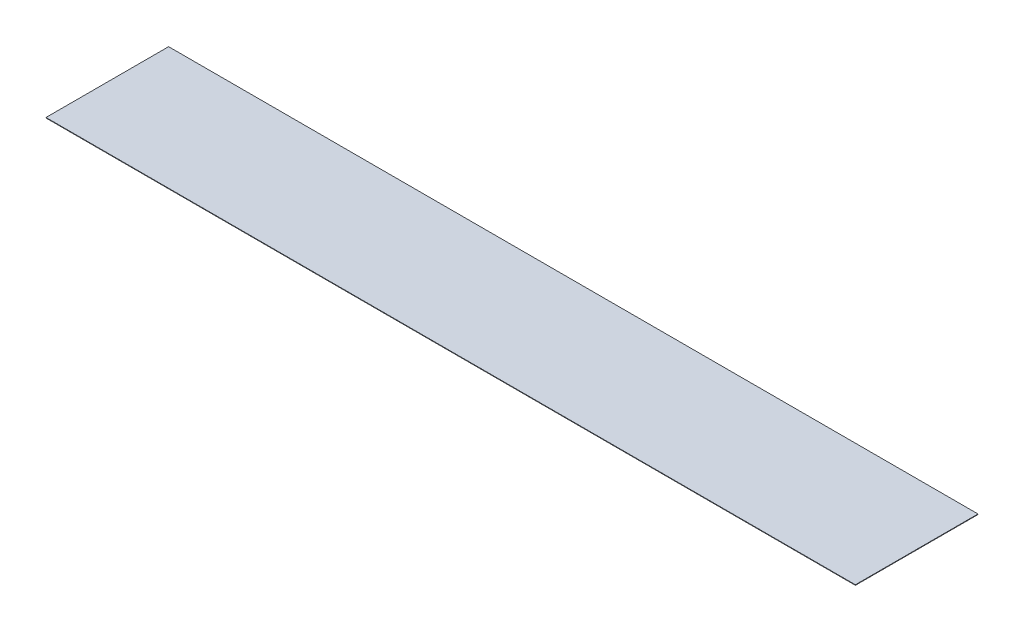
ISO-10303-21;
HEADER;
FILE_DESCRIPTION(('STEP AP214'),'2;1');
FILE_NAME('part.step','',(''),(''),'','','');
FILE_SCHEMA(('AUTOMOTIVE_DESIGN { 1 0 10303 214 1 1 1 1 }'));
ENDSEC;
DATA;
#1=APPLICATION_CONTEXT('core data for automotive mechanical design processes');
#2=APPLICATION_PROTOCOL_DEFINITION('international standard','automotive_design',2000,#1);
#3=PRODUCT_CONTEXT('',#1,'mechanical');
#4=PRODUCT('Part','Part','',(#3));
#5=PRODUCT_RELATED_PRODUCT_CATEGORY('part','',(#4));
#6=PRODUCT_DEFINITION_FORMATION('','',#4);
#7=PRODUCT_DEFINITION_CONTEXT('part definition',#1,'design');
#8=PRODUCT_DEFINITION('design','',#6,#7);
#9=PRODUCT_DEFINITION_SHAPE('','',#8);
#10=(LENGTH_UNIT() NAMED_UNIT(*) SI_UNIT(.MILLI.,.METRE.));
#11=(NAMED_UNIT(*) PLANE_ANGLE_UNIT() SI_UNIT($,.RADIAN.));
#12=(NAMED_UNIT(*) SI_UNIT($,.STERADIAN.) SOLID_ANGLE_UNIT());
#13=UNCERTAINTY_MEASURE_WITH_UNIT(LENGTH_MEASURE(1.E-05),#10,'distance_accuracy_value','');
#14=(GEOMETRIC_REPRESENTATION_CONTEXT(3) GLOBAL_UNCERTAINTY_ASSIGNED_CONTEXT((#13)) GLOBAL_UNIT_ASSIGNED_CONTEXT((#10,
#11,#12)) REPRESENTATION_CONTEXT('',''));
#15=CARTESIAN_POINT('',(0.,0.,0.));
#16=DIRECTION('',(0.,0.,1.));
#17=DIRECTION('',(1.,0.,0.));
#18=AXIS2_PLACEMENT_3D('',#15,#16,#17);
#19=CARTESIAN_POINT('',(7967.5,10.,-1207.));
#20=DIRECTION('',(-1.,0.,0.));
#21=DIRECTION('',(0.,0.,1.));
#22=AXIS2_PLACEMENT_3D('',#19,#20,#21);
#23=PLANE('',#22);
#24=DIRECTION('',(0.,0.,-1.));
#25=VECTOR('',#24,1.);
#26=CARTESIAN_POINT('',(7967.5,0.,-1207.));
#27=LINE('',#26,#25);
#28=CARTESIAN_POINT('',(7967.5,0.,1207.));
#29=VERTEX_POINT('',#28);
#30=CARTESIAN_POINT('',(7967.5,0.,-1207.));
#31=VERTEX_POINT('',#30);
#32=EDGE_CURVE('E109',#29,#31,#27,.T.);
#33=ORIENTED_EDGE('',*,*,#32,.T.);
#34=DIRECTION('',(0.,-1.,0.));
#35=VECTOR('',#34,1.);
#36=CARTESIAN_POINT('',(7967.5,10.,-1207.));
#37=LINE('',#36,#35);
#38=CARTESIAN_POINT('',(7967.5,10.,-1207.));
#39=VERTEX_POINT('',#38);
#40=EDGE_CURVE('E11',#39,#31,#37,.T.);
#41=ORIENTED_EDGE('',*,*,#40,.F.);
#42=DIRECTION('',(0.,0.,-1.));
#43=VECTOR('',#42,1.);
#44=CARTESIAN_POINT('',(7967.5,10.,-1207.));
#45=LINE('',#44,#43);
#46=CARTESIAN_POINT('',(7967.5,10.,1207.));
#47=VERTEX_POINT('',#46);
#48=EDGE_CURVE('E93',#47,#39,#45,.T.);
#49=ORIENTED_EDGE('',*,*,#48,.F.);
#50=DIRECTION('',(0.,-1.,0.));
#51=VECTOR('',#50,1.);
#52=CARTESIAN_POINT('',(7967.5,10.,1207.));
#53=LINE('',#52,#51);
#54=EDGE_CURVE('E105',#47,#29,#53,.T.);
#55=ORIENTED_EDGE('',*,*,#54,.T.);
#56=EDGE_LOOP('',(#33,#41,#49,#55));
#57=FACE_BOUND('',#56,.T.);
#58=ADVANCED_FACE('F41',(#57),#23,.F.);
#59=CARTESIAN_POINT('',(-7967.5,10.,-1207.));
#60=DIRECTION('',(0.,0.,1.));
#61=DIRECTION('',(1.,0.,0.));
#62=AXIS2_PLACEMENT_3D('',#59,#60,#61);
#63=PLANE('',#62);
#64=DIRECTION('',(-1.,0.,0.));
#65=VECTOR('',#64,1.);
#66=CARTESIAN_POINT('',(-7967.5,0.,-1207.));
#67=LINE('',#66,#65);
#68=CARTESIAN_POINT('',(-7967.5,0.,-1207.));
#69=VERTEX_POINT('',#68);
#70=EDGE_CURVE('E98',#31,#69,#67,.T.);
#71=ORIENTED_EDGE('',*,*,#70,.T.);
#72=DIRECTION('',(0.,-1.,0.));
#73=VECTOR('',#72,1.);
#74=CARTESIAN_POINT('',(-7967.5,10.,-1207.));
#75=LINE('',#74,#73);
#76=CARTESIAN_POINT('',(-7967.5,10.,-1207.));
#77=VERTEX_POINT('',#76);
#78=EDGE_CURVE('E50',#77,#69,#75,.T.);
#79=ORIENTED_EDGE('',*,*,#78,.F.);
#80=DIRECTION('',(-1.,0.,0.));
#81=VECTOR('',#80,1.);
#82=CARTESIAN_POINT('',(-7967.5,10.,-1207.));
#83=LINE('',#82,#81);
#84=EDGE_CURVE('E88',#39,#77,#83,.T.);
#85=ORIENTED_EDGE('',*,*,#84,.F.);
#86=ORIENTED_EDGE('',*,*,#40,.T.);
#87=EDGE_LOOP('',(#71,#79,#85,#86));
#88=FACE_BOUND('',#87,.T.);
#89=ADVANCED_FACE('F97',(#88),#63,.F.);
#90=CARTESIAN_POINT('',(-7967.5,10.,-1207.));
#91=DIRECTION('',(1.,0.,0.));
#92=DIRECTION('',(0.,0.,-1.));
#93=AXIS2_PLACEMENT_3D('',#90,#91,#92);
#94=PLANE('',#93);
#95=DIRECTION('',(0.,0.,1.));
#96=VECTOR('',#95,1.);
#97=CARTESIAN_POINT('',(-7967.5,0.,-1207.));
#98=LINE('',#97,#96);
#99=CARTESIAN_POINT('',(-7967.5,0.,1207.));
#100=VERTEX_POINT('',#99);
#101=EDGE_CURVE('E75',#69,#100,#98,.T.);
#102=ORIENTED_EDGE('',*,*,#101,.T.);
#103=DIRECTION('',(0.,-1.,0.));
#104=VECTOR('',#103,1.);
#105=CARTESIAN_POINT('',(-7967.5,10.,1207.));
#106=LINE('',#105,#104);
#107=CARTESIAN_POINT('',(-7967.5,10.,1207.));
#108=VERTEX_POINT('',#107);
#109=EDGE_CURVE('E100',#108,#100,#106,.T.);
#110=ORIENTED_EDGE('',*,*,#109,.F.);
#111=DIRECTION('',(0.,0.,1.));
#112=VECTOR('',#111,1.);
#113=CARTESIAN_POINT('',(-7967.5,10.,-1207.));
#114=LINE('',#113,#112);
#115=EDGE_CURVE('E91',#77,#108,#114,.T.);
#116=ORIENTED_EDGE('',*,*,#115,.F.);
#117=ORIENTED_EDGE('',*,*,#78,.T.);
#118=EDGE_LOOP('',(#102,#110,#116,#117));
#119=FACE_BOUND('',#118,.T.);
#120=ADVANCED_FACE('F101',(#119),#94,.F.);
#121=CARTESIAN_POINT('',(-7967.5,10.,1207.));
#122=DIRECTION('',(0.,0.,-1.));
#123=DIRECTION('',(-1.,0.,0.));
#124=AXIS2_PLACEMENT_3D('',#121,#122,#123);
#125=PLANE('',#124);
#126=DIRECTION('',(1.,0.,0.));
#127=VECTOR('',#126,1.);
#128=CARTESIAN_POINT('',(-7967.5,0.,1207.));
#129=LINE('',#128,#127);
#130=EDGE_CURVE('E81',#100,#29,#129,.T.);
#131=ORIENTED_EDGE('',*,*,#130,.T.);
#132=ORIENTED_EDGE('',*,*,#54,.F.);
#133=DIRECTION('',(1.,0.,0.));
#134=VECTOR('',#133,1.);
#135=CARTESIAN_POINT('',(-7967.5,10.,1207.));
#136=LINE('',#135,#134);
#137=EDGE_CURVE('E58',#108,#47,#136,.T.);
#138=ORIENTED_EDGE('',*,*,#137,.F.);
#139=ORIENTED_EDGE('',*,*,#109,.T.);
#140=EDGE_LOOP('',(#131,#132,#138,#139));
#141=FACE_BOUND('',#140,.T.);
#142=ADVANCED_FACE('F122',(#141),#125,.F.);
#143=CARTESIAN_POINT('',(0.,10.,0.));
#144=DIRECTION('',(0.,1.,0.));
#145=DIRECTION('',(0.,0.,1.));
#146=AXIS2_PLACEMENT_3D('',#143,#144,#145);
#147=PLANE('',#146);
#148=ORIENTED_EDGE('',*,*,#48,.T.);
#149=ORIENTED_EDGE('',*,*,#84,.T.);
#150=ORIENTED_EDGE('',*,*,#115,.T.);
#151=ORIENTED_EDGE('',*,*,#137,.T.);
#152=EDGE_LOOP('',(#148,#149,#150,#151));
#153=FACE_BOUND('',#152,.T.);
#154=ADVANCED_FACE('F89',(#153),#147,.T.);
#155=CARTESIAN_POINT('',(0.,0.,0.));
#156=DIRECTION('',(0.,1.,0.));
#157=DIRECTION('',(0.,0.,1.));
#158=AXIS2_PLACEMENT_3D('',#155,#156,#157);
#159=PLANE('',#158);
#160=ORIENTED_EDGE('',*,*,#32,.F.);
#161=ORIENTED_EDGE('',*,*,#130,.F.);
#162=ORIENTED_EDGE('',*,*,#101,.F.);
#163=ORIENTED_EDGE('',*,*,#70,.F.);
#164=EDGE_LOOP('',(#160,#161,#162,#163));
#165=FACE_BOUND('',#164,.T.);
#166=ADVANCED_FACE('F125',(#165),#159,.F.);
#167=CLOSED_SHELL('',(#58,#89,#120,#142,#154,#166));
#168=MANIFOLD_SOLID_BREP('B2',#167);
#169=ADVANCED_BREP_SHAPE_REPRESENTATION('',(#18,#168),#14);
#170=SHAPE_DEFINITION_REPRESENTATION(#9,#169);
ENDSEC;
END-ISO-10303-21;
